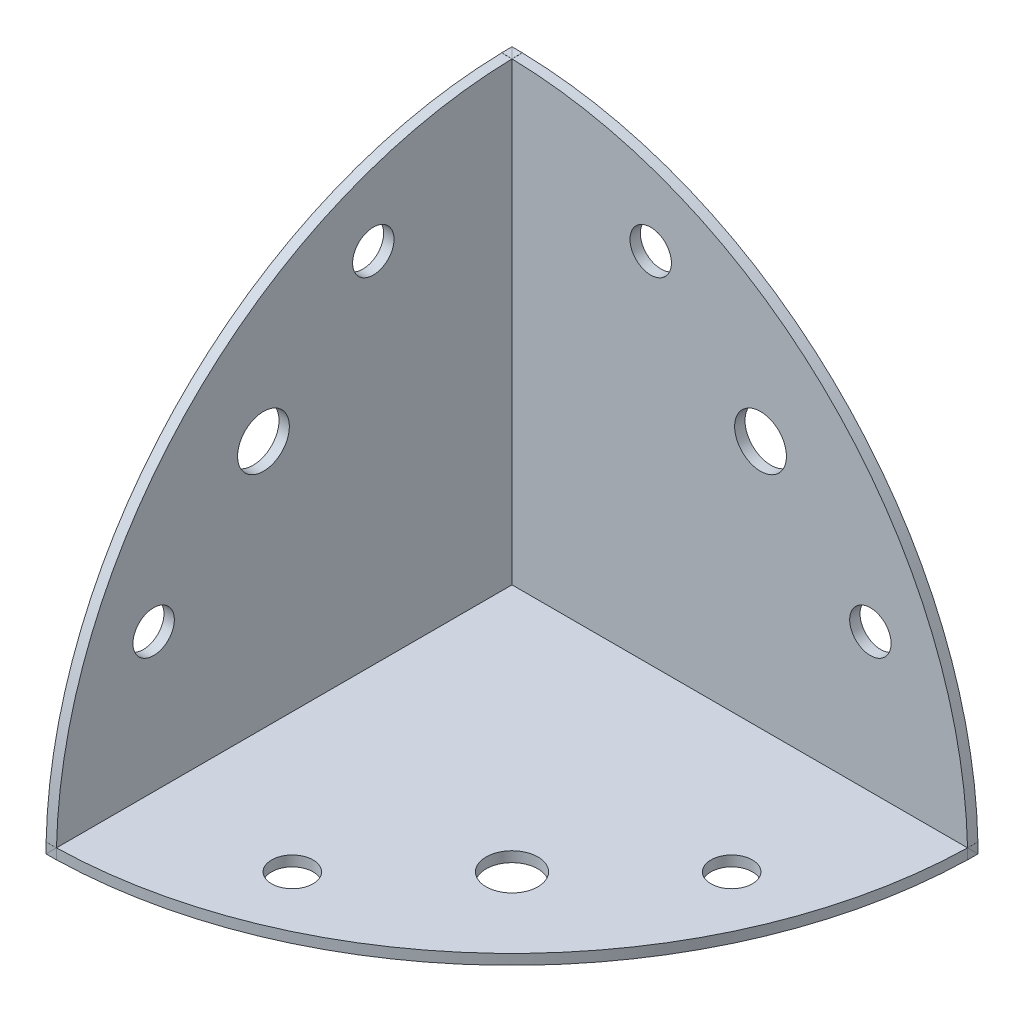
ISO-10303-21;
HEADER;
FILE_DESCRIPTION(('STEP AP214'),'2;1');
FILE_NAME('part.step','',(''),(''),'','','');
FILE_SCHEMA(('AUTOMOTIVE_DESIGN { 1 0 10303 214 1 1 1 1 }'));
ENDSEC;
DATA;
#1=APPLICATION_CONTEXT('core data for automotive mechanical design processes');
#2=APPLICATION_PROTOCOL_DEFINITION('international standard','automotive_design',2000,#1);
#3=PRODUCT_CONTEXT('',#1,'mechanical');
#4=PRODUCT('Part','Part','',(#3));
#5=PRODUCT_RELATED_PRODUCT_CATEGORY('part','',(#4));
#6=PRODUCT_DEFINITION_FORMATION('','',#4);
#7=PRODUCT_DEFINITION_CONTEXT('part definition',#1,'design');
#8=PRODUCT_DEFINITION('design','',#6,#7);
#9=PRODUCT_DEFINITION_SHAPE('','',#8);
#10=(LENGTH_UNIT() NAMED_UNIT(*) SI_UNIT(.MILLI.,.METRE.));
#11=(NAMED_UNIT(*) PLANE_ANGLE_UNIT() SI_UNIT($,.RADIAN.));
#12=(NAMED_UNIT(*) SI_UNIT($,.STERADIAN.) SOLID_ANGLE_UNIT());
#13=UNCERTAINTY_MEASURE_WITH_UNIT(LENGTH_MEASURE(1.E-05),#10,'distance_accuracy_value','');
#14=(GEOMETRIC_REPRESENTATION_CONTEXT(3) GLOBAL_UNCERTAINTY_ASSIGNED_CONTEXT((#13)) GLOBAL_UNIT_ASSIGNED_CONTEXT((#10,
#11,#12)) REPRESENTATION_CONTEXT('',''));
#15=CARTESIAN_POINT('',(0.,0.,0.));
#16=DIRECTION('',(0.,0.,1.));
#17=DIRECTION('',(1.,0.,0.));
#18=AXIS2_PLACEMENT_3D('',#15,#16,#17);
#19=CARTESIAN_POINT('',(0.,1.,0.));
#20=DIRECTION('',(0.,-1.,0.));
#21=DIRECTION('',(0.,0.,-1.));
#22=AXIS2_PLACEMENT_3D('',#19,#20,#21);
#23=PLANE('',#22);
#24=DIRECTION('',(-1.,0.,0.));
#25=VECTOR('',#24,1.);
#26=CARTESIAN_POINT('',(1.,1.,44.988887516808));
#27=LINE('',#26,#25);
#28=CARTESIAN_POINT('',(9.50100314789726E-13,1.,44.988887516808));
#29=VERTEX_POINT('',#28);
#30=CARTESIAN_POINT('',(1.,1.,44.988887516808));
#31=VERTEX_POINT('',#30);
#32=EDGE_CURVE('E205',#29,#31,#27,.F.);
#33=ORIENTED_EDGE('',*,*,#32,.F.);
#34=DIRECTION('',(0.,0.,1.));
#35=VECTOR('',#34,1.);
#36=CARTESIAN_POINT('',(9.5033499438199E-13,1.,45.));
#37=LINE('',#36,#35);
#38=CARTESIAN_POINT('',(9.5033499438199E-13,1.,45.));
#39=VERTEX_POINT('',#38);
#40=EDGE_CURVE('E267',#29,#39,#37,.T.);
#41=ORIENTED_EDGE('',*,*,#40,.T.);
#42=CARTESIAN_POINT('',(0.,1.,0.));
#43=DIRECTION('',(0.,1.,0.));
#44=DIRECTION('',(0.,0.,-1.));
#45=AXIS2_PLACEMENT_3D('',#42,#43,#44);
#46=CIRCLE('',#45,45.);
#47=EDGE_CURVE('E270',#39,#31,#46,.T.);
#48=ORIENTED_EDGE('',*,*,#47,.T.);
#49=EDGE_LOOP('',(#33,#41,#48));
#50=FACE_BOUND('',#49,.T.);
#51=ADVANCED_FACE('F33',(#50),#23,.F.);
#52=CARTESIAN_POINT('',(0.,1.,0.));
#53=DIRECTION('',(0.,-1.,0.));
#54=DIRECTION('',(0.,0.,-1.));
#55=AXIS2_PLACEMENT_3D('',#52,#53,#54);
#56=CYLINDRICAL_SURFACE('',#55,45.);
#57=CARTESIAN_POINT('',(0.,0.,0.));
#58=DIRECTION('',(0.707106781186547,-0.707106781186547,0.));
#59=DIRECTION('',(-0.707106781186547,-0.707106781186547,0.));
#60=AXIS2_PLACEMENT_3D('',#57,#58,#59);
#61=ELLIPSE('',#60,63.6396103067893,45.);
#62=CARTESIAN_POINT('',(0.,0.,45.));
#63=VERTEX_POINT('',#62);
#64=EDGE_CURVE('E55',#31,#63,#61,.T.);
#65=ORIENTED_EDGE('',*,*,#64,.F.);
#66=ORIENTED_EDGE('',*,*,#47,.F.);
#67=DIRECTION('',(0.,-1.,0.));
#68=VECTOR('',#67,1.);
#69=CARTESIAN_POINT('',(9.5033499438199E-13,1.,45.));
#70=LINE('',#69,#68);
#71=EDGE_CURVE('E281',#39,#63,#70,.T.);
#72=ORIENTED_EDGE('',*,*,#71,.T.);
#73=EDGE_LOOP('',(#65,#66,#72));
#74=FACE_BOUND('',#73,.T.);
#75=ADVANCED_FACE('F328',(#74),#56,.T.);
#76=CARTESIAN_POINT('',(0.,0.,1.));
#77=DIRECTION('',(0.,0.,-1.));
#78=DIRECTION('',(-1.,0.,0.));
#79=AXIS2_PLACEMENT_3D('',#76,#77,#78);
#80=PLANE('',#79);
#81=DIRECTION('',(-1.,0.,0.));
#82=VECTOR('',#81,1.);
#83=CARTESIAN_POINT('',(1.,44.988887516808,1.));
#84=LINE('',#83,#82);
#85=CARTESIAN_POINT('',(1.,44.988887516808,1.));
#86=VERTEX_POINT('',#85);
#87=CARTESIAN_POINT('',(0.,44.988887516808,1.));
#88=VERTEX_POINT('',#87);
#89=EDGE_CURVE('E132',#86,#88,#84,.T.);
#90=ORIENTED_EDGE('',*,*,#89,.F.);
#91=CARTESIAN_POINT('',(0.,0.,1.));
#92=DIRECTION('',(0.,0.,1.));
#93=DIRECTION('',(-1.,0.,0.));
#94=AXIS2_PLACEMENT_3D('',#91,#92,#93);
#95=CIRCLE('',#94,45.);
#96=CARTESIAN_POINT('',(0.,45.,1.));
#97=VERTEX_POINT('',#96);
#98=EDGE_CURVE('E229',#86,#97,#95,.T.);
#99=ORIENTED_EDGE('',*,*,#98,.T.);
#100=DIRECTION('',(0.,-1.,0.));
#101=VECTOR('',#100,1.);
#102=CARTESIAN_POINT('',(0.,45.,1.));
#103=LINE('',#102,#101);
#104=EDGE_CURVE('E233',#97,#88,#103,.T.);
#105=ORIENTED_EDGE('',*,*,#104,.T.);
#106=EDGE_LOOP('',(#90,#99,#105));
#107=FACE_BOUND('',#106,.T.);
#108=ADVANCED_FACE('F312',(#107),#80,.F.);
#109=CARTESIAN_POINT('',(0.,0.,1.));
#110=DIRECTION('',(0.,0.,-1.));
#111=DIRECTION('',(-1.,0.,0.));
#112=AXIS2_PLACEMENT_3D('',#109,#110,#111);
#113=CYLINDRICAL_SURFACE('',#112,45.);
#114=CARTESIAN_POINT('',(0.,0.,0.));
#115=DIRECTION('',(0.707106781186547,0.,-0.707106781186547));
#116=DIRECTION('',(-0.707106781186547,0.,-0.707106781186547));
#117=AXIS2_PLACEMENT_3D('',#114,#115,#116);
#118=ELLIPSE('',#117,63.6396103067893,45.);
#119=CARTESIAN_POINT('',(0.,45.,0.));
#120=VERTEX_POINT('',#119);
#121=EDGE_CURVE('E41',#120,#86,#118,.T.);
#122=ORIENTED_EDGE('',*,*,#121,.F.);
#123=DIRECTION('',(0.,0.,-1.));
#124=VECTOR('',#123,1.);
#125=CARTESIAN_POINT('',(0.,45.,1.));
#126=LINE('',#125,#124);
#127=EDGE_CURVE('E235',#97,#120,#126,.T.);
#128=ORIENTED_EDGE('',*,*,#127,.F.);
#129=ORIENTED_EDGE('',*,*,#98,.F.);
#130=EDGE_LOOP('',(#122,#128,#129));
#131=FACE_BOUND('',#130,.T.);
#132=ADVANCED_FACE('F316',(#131),#113,.T.);
#133=CARTESIAN_POINT('',(35.6066017177983,1.,14.3933982822021));
#134=DIRECTION('',(0.,1.,0.));
#135=DIRECTION('',(0.,0.,-1.));
#136=AXIS2_PLACEMENT_3D('',#133,#134,#135);
#137=CIRCLE('',#136,2.);
#138=CARTESIAN_POINT('',(35.6066017177983,1.,12.3933982822021));
#139=VERTEX_POINT('',#138);
#140=EDGE_CURVE('E247',#139,#139,#137,.T.);
#141=ORIENTED_EDGE('',*,*,#140,.F.);
#142=EDGE_LOOP('',(#141));
#143=FACE_BOUND('',#142,.T.);
#144=CARTESIAN_POINT('',(14.3933982822017,1.,35.6066017177984));
#145=DIRECTION('',(0.,1.,0.));
#146=DIRECTION('',(0.,0.,1.));
#147=AXIS2_PLACEMENT_3D('',#144,#145,#146);
#148=CIRCLE('',#147,2.);
#149=CARTESIAN_POINT('',(14.3933982822017,1.,37.6066017177984));
#150=VERTEX_POINT('',#149);
#151=EDGE_CURVE('E253',#150,#150,#148,.T.);
#152=ORIENTED_EDGE('',*,*,#151,.F.);
#153=EDGE_LOOP('',(#152));
#154=FACE_BOUND('',#153,.T.);
#155=CARTESIAN_POINT('',(25.,1.,25.0000000000003));
#156=DIRECTION('',(0.,1.,0.));
#157=DIRECTION('',(0.,0.,1.));
#158=AXIS2_PLACEMENT_3D('',#155,#156,#157);
#159=CIRCLE('',#158,2.5);
#160=CARTESIAN_POINT('',(25.,1.,27.5000000000003));
#161=VERTEX_POINT('',#160);
#162=EDGE_CURVE('E259',#161,#161,#159,.T.);
#163=ORIENTED_EDGE('',*,*,#162,.F.);
#164=EDGE_LOOP('',(#163));
#165=FACE_BOUND('',#164,.T.);
#166=DIRECTION('',(1.,0.,0.));
#167=VECTOR('',#166,1.);
#168=CARTESIAN_POINT('',(0.,1.,1.));
#169=LINE('',#168,#167);
#170=CARTESIAN_POINT('',(1.,1.,1.));
#171=VERTEX_POINT('',#170);
#172=CARTESIAN_POINT('',(44.988887516808,1.,1.));
#173=VERTEX_POINT('',#172);
#174=EDGE_CURVE('E244',#171,#173,#169,.T.);
#175=ORIENTED_EDGE('',*,*,#174,.F.);
#176=DIRECTION('',(0.,0.,1.));
#177=VECTOR('',#176,1.);
#178=CARTESIAN_POINT('',(1.,1.,0.));
#179=LINE('',#178,#177);
#180=EDGE_CURVE('E197',#171,#31,#179,.T.);
#181=ORIENTED_EDGE('',*,*,#180,.T.);
#182=EDGE_CURVE('E273',#31,#173,#46,.T.);
#183=ORIENTED_EDGE('',*,*,#182,.T.);
#184=EDGE_LOOP('',(#175,#181,#183));
#185=FACE_BOUND('',#184,.T.);
#186=ADVANCED_FACE('F339',(#143,#154,#165,#185),#23,.F.);
#187=DIRECTION('',(0.,0.,-1.));
#188=VECTOR('',#187,1.);
#189=CARTESIAN_POINT('',(44.988887516808,1.,1.));
#190=LINE('',#189,#188);
#191=CARTESIAN_POINT('',(44.988887516808,1.,0.));
#192=VERTEX_POINT('',#191);
#193=EDGE_CURVE('E241',#173,#192,#190,.T.);
#194=ORIENTED_EDGE('',*,*,#193,.F.);
#195=CARTESIAN_POINT('',(45.,1.,0.));
#196=VERTEX_POINT('',#195);
#197=EDGE_CURVE('E269',#173,#196,#46,.T.);
#198=ORIENTED_EDGE('',*,*,#197,.T.);
#199=DIRECTION('',(-1.,0.,0.));
#200=VECTOR('',#199,1.);
#201=CARTESIAN_POINT('',(0.,1.,0.));
#202=LINE('',#201,#200);
#203=EDGE_CURVE('E265',#196,#192,#202,.T.);
#204=ORIENTED_EDGE('',*,*,#203,.T.);
#205=EDGE_LOOP('',(#194,#198,#204));
#206=FACE_BOUND('',#205,.T.);
#207=ADVANCED_FACE('F305',(#206),#23,.F.);
#208=ORIENTED_EDGE('',*,*,#182,.F.);
#209=DIRECTION('',(0.,-1.,0.));
#210=VECTOR('',#209,1.);
#211=CARTESIAN_POINT('',(1.,1.,44.988887516808));
#212=LINE('',#211,#210);
#213=CARTESIAN_POINT('',(1.,0.,44.988887516808));
#214=VERTEX_POINT('',#213);
#215=EDGE_CURVE('E149',#31,#214,#212,.T.);
#216=ORIENTED_EDGE('',*,*,#215,.T.);
#217=CARTESIAN_POINT('',(0.,0.,0.));
#218=DIRECTION('',(0.,1.,0.));
#219=DIRECTION('',(0.,0.,-1.));
#220=AXIS2_PLACEMENT_3D('',#217,#218,#219);
#221=CIRCLE('',#220,45.);
#222=CARTESIAN_POINT('',(44.988887516808,0.,1.));
#223=VERTEX_POINT('',#222);
#224=EDGE_CURVE('E158',#214,#223,#221,.T.);
#225=ORIENTED_EDGE('',*,*,#224,.T.);
#226=DIRECTION('',(0.,-1.,0.));
#227=VECTOR('',#226,1.);
#228=CARTESIAN_POINT('',(44.988887516808,1.,1.));
#229=LINE('',#228,#227);
#230=EDGE_CURVE('E287',#173,#223,#229,.T.);
#231=ORIENTED_EDGE('',*,*,#230,.F.);
#232=EDGE_LOOP('',(#208,#216,#225,#231));
#233=FACE_BOUND('',#232,.T.);
#234=ADVANCED_FACE('F331',(#233),#56,.T.);
#235=CARTESIAN_POINT('',(0.,0.,0.));
#236=DIRECTION('',(0.,-0.707106781186547,0.707106781186547));
#237=DIRECTION('',(0.,-0.707106781186547,-0.707106781186547));
#238=AXIS2_PLACEMENT_3D('',#235,#236,#237);
#239=ELLIPSE('',#238,63.6396103067893,45.);
#240=CARTESIAN_POINT('',(45.,0.,0.));
#241=VERTEX_POINT('',#240);
#242=EDGE_CURVE('E284',#241,#173,#239,.T.);
#243=ORIENTED_EDGE('',*,*,#242,.F.);
#244=DIRECTION('',(0.,-1.,0.));
#245=VECTOR('',#244,1.);
#246=CARTESIAN_POINT('',(45.,1.,0.));
#247=LINE('',#246,#245);
#248=EDGE_CURVE('E272',#196,#241,#247,.T.);
#249=ORIENTED_EDGE('',*,*,#248,.F.);
#250=ORIENTED_EDGE('',*,*,#197,.F.);
#251=EDGE_LOOP('',(#243,#249,#250));
#252=FACE_BOUND('',#251,.T.);
#253=ADVANCED_FACE('F301',(#252),#56,.T.);
#254=CARTESIAN_POINT('',(0.,0.,0.));
#255=DIRECTION('',(0.,-1.,0.));
#256=DIRECTION('',(0.,0.,-1.));
#257=AXIS2_PLACEMENT_3D('',#254,#255,#256);
#258=PLANE('',#257);
#259=ORIENTED_EDGE('',*,*,#224,.F.);
#260=DIRECTION('',(0.,0.,-1.));
#261=VECTOR('',#260,1.);
#262=CARTESIAN_POINT('',(1.,0.,0.));
#263=LINE('',#262,#261);
#264=CARTESIAN_POINT('',(1.,0.,45.));
#265=VERTEX_POINT('',#264);
#266=EDGE_CURVE('E121',#265,#214,#263,.T.);
#267=ORIENTED_EDGE('',*,*,#266,.F.);
#268=DIRECTION('',(-1.,0.,0.));
#269=VECTOR('',#268,1.);
#270=CARTESIAN_POINT('',(1.,0.,45.));
#271=LINE('',#270,#269);
#272=EDGE_CURVE('E133',#265,#63,#271,.T.);
#273=ORIENTED_EDGE('',*,*,#272,.T.);
#274=DIRECTION('',(0.,0.,1.));
#275=VECTOR('',#274,1.);
#276=CARTESIAN_POINT('',(9.5033499438199E-13,0.,45.));
#277=LINE('',#276,#275);
#278=CARTESIAN_POINT('',(0.,0.,0.));
#279=VERTEX_POINT('',#278);
#280=EDGE_CURVE('E275',#279,#63,#277,.T.);
#281=ORIENTED_EDGE('',*,*,#280,.F.);
#282=DIRECTION('',(-1.,0.,0.));
#283=VECTOR('',#282,1.);
#284=CARTESIAN_POINT('',(0.,0.,0.));
#285=LINE('',#284,#283);
#286=EDGE_CURVE('E262',#241,#279,#285,.T.);
#287=ORIENTED_EDGE('',*,*,#286,.F.);
#288=DIRECTION('',(0.,0.,-1.));
#289=VECTOR('',#288,1.);
#290=CARTESIAN_POINT('',(45.,0.,1.));
#291=LINE('',#290,#289);
#292=CARTESIAN_POINT('',(45.,0.,1.));
#293=VERTEX_POINT('',#292);
#294=EDGE_CURVE('E238',#293,#241,#291,.T.);
#295=ORIENTED_EDGE('',*,*,#294,.F.);
#296=DIRECTION('',(1.,0.,0.));
#297=VECTOR('',#296,1.);
#298=CARTESIAN_POINT('',(0.,0.,1.));
#299=LINE('',#298,#297);
#300=EDGE_CURVE('E227',#223,#293,#299,.T.);
#301=ORIENTED_EDGE('',*,*,#300,.F.);
#302=EDGE_LOOP('',(#259,#267,#273,#281,#287,#295,#301));
#303=FACE_BOUND('',#302,.T.);
#304=CARTESIAN_POINT('',(14.3933982822017,0.,35.6066017177984));
#305=DIRECTION('',(0.,1.,0.));
#306=DIRECTION('',(0.,0.,1.));
#307=AXIS2_PLACEMENT_3D('',#304,#305,#306);
#308=CIRCLE('',#307,2.);
#309=CARTESIAN_POINT('',(14.3933982822017,0.,37.6066017177984));
#310=VERTEX_POINT('',#309);
#311=EDGE_CURVE('E250',#310,#310,#308,.T.);
#312=ORIENTED_EDGE('',*,*,#311,.T.);
#313=EDGE_LOOP('',(#312));
#314=FACE_BOUND('',#313,.T.);
#315=CARTESIAN_POINT('',(25.,0.,25.0000000000003));
#316=DIRECTION('',(0.,1.,0.));
#317=DIRECTION('',(0.,0.,1.));
#318=AXIS2_PLACEMENT_3D('',#315,#316,#317);
#319=CIRCLE('',#318,2.5);
#320=CARTESIAN_POINT('',(25.,0.,27.5000000000003));
#321=VERTEX_POINT('',#320);
#322=EDGE_CURVE('E256',#321,#321,#319,.T.);
#323=ORIENTED_EDGE('',*,*,#322,.T.);
#324=EDGE_LOOP('',(#323));
#325=FACE_BOUND('',#324,.T.);
#326=CARTESIAN_POINT('',(35.6066017177983,0.,14.3933982822021));
#327=DIRECTION('',(0.,1.,0.));
#328=DIRECTION('',(0.,0.,-1.));
#329=AXIS2_PLACEMENT_3D('',#326,#327,#328);
#330=CIRCLE('',#329,2.);
#331=CARTESIAN_POINT('',(35.6066017177983,0.,12.3933982822021));
#332=VERTEX_POINT('',#331);
#333=EDGE_CURVE('E246',#332,#332,#330,.T.);
#334=ORIENTED_EDGE('',*,*,#333,.T.);
#335=EDGE_LOOP('',(#334));
#336=FACE_BOUND('',#335,.T.);
#337=ADVANCED_FACE('F155',(#303,#314,#325,#336),#258,.T.);
#338=CARTESIAN_POINT('',(0.,1.,0.));
#339=DIRECTION('',(0.,0.,1.));
#340=DIRECTION('',(1.,0.,0.));
#341=AXIS2_PLACEMENT_3D('',#338,#339,#340);
#342=PLANE('',#341);
#343=ORIENTED_EDGE('',*,*,#286,.T.);
#344=DIRECTION('',(0.,-1.,0.));
#345=VECTOR('',#344,1.);
#346=CARTESIAN_POINT('',(0.,1.,0.));
#347=LINE('',#346,#345);
#348=EDGE_CURVE('E128',#120,#279,#347,.T.);
#349=ORIENTED_EDGE('',*,*,#348,.F.);
#350=DIRECTION('',(-1.,0.,0.));
#351=VECTOR('',#350,1.);
#352=CARTESIAN_POINT('',(1.,45.,0.));
#353=LINE('',#352,#351);
#354=CARTESIAN_POINT('',(1.,45.,0.));
#355=VERTEX_POINT('',#354);
#356=EDGE_CURVE('E125',#355,#120,#353,.T.);
#357=ORIENTED_EDGE('',*,*,#356,.F.);
#358=DIRECTION('',(0.,1.,0.));
#359=VECTOR('',#358,1.);
#360=CARTESIAN_POINT('',(1.,45.,0.));
#361=LINE('',#360,#359);
#362=CARTESIAN_POINT('',(1.,44.988887516808,0.));
#363=VERTEX_POINT('',#362);
#364=EDGE_CURVE('E112',#363,#355,#361,.T.);
#365=ORIENTED_EDGE('',*,*,#364,.F.);
#366=CARTESIAN_POINT('',(0.,0.,0.));
#367=DIRECTION('',(0.,0.,1.));
#368=DIRECTION('',(-1.,0.,0.));
#369=AXIS2_PLACEMENT_3D('',#366,#367,#368);
#370=CIRCLE('',#369,45.);
#371=EDGE_CURVE('E224',#192,#363,#370,.T.);
#372=ORIENTED_EDGE('',*,*,#371,.F.);
#373=ORIENTED_EDGE('',*,*,#203,.F.);
#374=ORIENTED_EDGE('',*,*,#248,.T.);
#375=EDGE_LOOP('',(#343,#349,#357,#365,#372,#373,#374));
#376=FACE_BOUND('',#375,.T.);
#377=CARTESIAN_POINT('',(35.6066017177983,14.3933982822021,0.));
#378=DIRECTION('',(0.,0.,1.));
#379=DIRECTION('',(-1.,0.,0.));
#380=AXIS2_PLACEMENT_3D('',#377,#378,#379);
#381=CIRCLE('',#380,2.);
#382=CARTESIAN_POINT('',(33.6066017177983,14.3933982822021,0.));
#383=VERTEX_POINT('',#382);
#384=EDGE_CURVE('E203',#383,#383,#381,.T.);
#385=ORIENTED_EDGE('',*,*,#384,.T.);
#386=EDGE_LOOP('',(#385));
#387=FACE_BOUND('',#386,.T.);
#388=CARTESIAN_POINT('',(25.,25.0000000000003,0.));
#389=DIRECTION('',(0.,0.,1.));
#390=DIRECTION('',(1.,0.,0.));
#391=AXIS2_PLACEMENT_3D('',#388,#389,#390);
#392=CIRCLE('',#391,2.5);
#393=CARTESIAN_POINT('',(27.5,25.0000000000003,0.));
#394=VERTEX_POINT('',#393);
#395=EDGE_CURVE('E218',#394,#394,#392,.T.);
#396=ORIENTED_EDGE('',*,*,#395,.T.);
#397=EDGE_LOOP('',(#396));
#398=FACE_BOUND('',#397,.T.);
#399=CARTESIAN_POINT('',(14.3933982822017,35.6066017177984,0.));
#400=DIRECTION('',(0.,0.,1.));
#401=DIRECTION('',(1.,0.,0.));
#402=AXIS2_PLACEMENT_3D('',#399,#400,#401);
#403=CIRCLE('',#402,2.);
#404=CARTESIAN_POINT('',(16.3933982822017,35.6066017177984,0.));
#405=VERTEX_POINT('',#404);
#406=EDGE_CURVE('E212',#405,#405,#403,.T.);
#407=ORIENTED_EDGE('',*,*,#406,.T.);
#408=EDGE_LOOP('',(#407));
#409=FACE_BOUND('',#408,.T.);
#410=ADVANCED_FACE('F35',(#376,#387,#398,#409),#342,.F.);
#411=CARTESIAN_POINT('',(9.5033499438199E-13,1.,45.));
#412=DIRECTION('',(1.,0.,0.));
#413=DIRECTION('',(0.,0.,-1.));
#414=AXIS2_PLACEMENT_3D('',#411,#412,#413);
#415=PLANE('',#414);
#416=ORIENTED_EDGE('',*,*,#40,.F.);
#417=CARTESIAN_POINT('',(0.,0.,0.));
#418=DIRECTION('',(1.,0.,0.));
#419=DIRECTION('',(0.,0.,-1.));
#420=AXIS2_PLACEMENT_3D('',#417,#418,#419);
#421=CIRCLE('',#420,45.);
#422=EDGE_CURVE('E159',#88,#29,#421,.T.);
#423=ORIENTED_EDGE('',*,*,#422,.F.);
#424=ORIENTED_EDGE('',*,*,#104,.F.);
#425=ORIENTED_EDGE('',*,*,#127,.T.);
#426=ORIENTED_EDGE('',*,*,#348,.T.);
#427=ORIENTED_EDGE('',*,*,#280,.T.);
#428=ORIENTED_EDGE('',*,*,#71,.F.);
#429=EDGE_LOOP('',(#416,#423,#424,#425,#426,#427,#428));
#430=FACE_BOUND('',#429,.T.);
#431=CARTESIAN_POINT('',(0.,24.9999999999997,25.));
#432=DIRECTION('',(1.,0.,0.));
#433=DIRECTION('',(0.,0.,-1.));
#434=AXIS2_PLACEMENT_3D('',#431,#432,#433);
#435=CIRCLE('',#434,2.5);
#436=CARTESIAN_POINT('',(0.,24.9999999999997,22.5));
#437=VERTEX_POINT('',#436);
#438=EDGE_CURVE('E164',#437,#437,#435,.T.);
#439=ORIENTED_EDGE('',*,*,#438,.T.);
#440=EDGE_LOOP('',(#439));
#441=FACE_BOUND('',#440,.T.);
#442=CARTESIAN_POINT('',(0.,35.606601717798,14.3933982822018));
#443=DIRECTION('',(1.,0.,0.));
#444=DIRECTION('',(0.,0.,-1.));
#445=AXIS2_PLACEMENT_3D('',#442,#443,#444);
#446=CIRCLE('',#445,2.);
#447=CARTESIAN_POINT('',(0.,35.606601717798,12.3933982822018));
#448=VERTEX_POINT('',#447);
#449=EDGE_CURVE('E170',#448,#448,#446,.T.);
#450=ORIENTED_EDGE('',*,*,#449,.T.);
#451=EDGE_LOOP('',(#450));
#452=FACE_BOUND('',#451,.T.);
#453=CARTESIAN_POINT('',(0.,14.3933982822015,35.6066017177981));
#454=DIRECTION('',(1.,0.,0.));
#455=DIRECTION('',(0.,0.,1.));
#456=AXIS2_PLACEMENT_3D('',#453,#454,#455);
#457=CIRCLE('',#456,2.);
#458=CARTESIAN_POINT('',(0.,14.3933982822015,37.6066017177981));
#459=VERTEX_POINT('',#458);
#460=EDGE_CURVE('E176',#459,#459,#457,.T.);
#461=ORIENTED_EDGE('',*,*,#460,.T.);
#462=EDGE_LOOP('',(#461));
#463=FACE_BOUND('',#462,.T.);
#464=ADVANCED_FACE('F320',(#430,#441,#452,#463),#415,.F.);
#465=CARTESIAN_POINT('',(25.,1.,25.0000000000003));
#466=DIRECTION('',(0.,-1.,0.));
#467=DIRECTION('',(0.,0.,-1.));
#468=AXIS2_PLACEMENT_3D('',#465,#466,#467);
#469=CYLINDRICAL_SURFACE('',#468,2.5);
#470=ORIENTED_EDGE('',*,*,#162,.T.);
#471=EDGE_LOOP('',(#470));
#472=FACE_BOUND('',#471,.T.);
#473=ORIENTED_EDGE('',*,*,#322,.F.);
#474=EDGE_LOOP('',(#473));
#475=FACE_BOUND('',#474,.T.);
#476=ADVANCED_FACE('F366',(#472,#475),#469,.F.);
#477=CARTESIAN_POINT('',(14.3933982822017,1.,35.6066017177984));
#478=DIRECTION('',(0.,-1.,0.));
#479=DIRECTION('',(0.,0.,-1.));
#480=AXIS2_PLACEMENT_3D('',#477,#478,#479);
#481=CYLINDRICAL_SURFACE('',#480,2.);
#482=ORIENTED_EDGE('',*,*,#151,.T.);
#483=EDGE_LOOP('',(#482));
#484=FACE_BOUND('',#483,.T.);
#485=ORIENTED_EDGE('',*,*,#311,.F.);
#486=EDGE_LOOP('',(#485));
#487=FACE_BOUND('',#486,.T.);
#488=ADVANCED_FACE('F362',(#484,#487),#481,.F.);
#489=CARTESIAN_POINT('',(35.6066017177983,1.,14.3933982822021));
#490=DIRECTION('',(0.,-1.,0.));
#491=DIRECTION('',(0.,0.,-1.));
#492=AXIS2_PLACEMENT_3D('',#489,#490,#491);
#493=CYLINDRICAL_SURFACE('',#492,2.);
#494=ORIENTED_EDGE('',*,*,#140,.T.);
#495=EDGE_LOOP('',(#494));
#496=FACE_BOUND('',#495,.T.);
#497=ORIENTED_EDGE('',*,*,#333,.F.);
#498=EDGE_LOOP('',(#497));
#499=FACE_BOUND('',#498,.T.);
#500=ADVANCED_FACE('F359',(#496,#499),#493,.F.);
#501=ORIENTED_EDGE('',*,*,#294,.T.);
#502=ORIENTED_EDGE('',*,*,#242,.T.);
#503=EDGE_CURVE('E230',#293,#173,#95,.T.);
#504=ORIENTED_EDGE('',*,*,#503,.F.);
#505=EDGE_LOOP('',(#501,#502,#504));
#506=FACE_BOUND('',#505,.T.);
#507=ADVANCED_FACE('F298',(#506),#113,.T.);
#508=ORIENTED_EDGE('',*,*,#503,.T.);
#509=ORIENTED_EDGE('',*,*,#230,.T.);
#510=ORIENTED_EDGE('',*,*,#300,.T.);
#511=EDGE_LOOP('',(#508,#509,#510));
#512=FACE_BOUND('',#511,.T.);
#513=ADVANCED_FACE('F291',(#512),#80,.F.);
#514=CARTESIAN_POINT('',(25.,25.0000000000003,1.));
#515=DIRECTION('',(0.,0.,1.));
#516=DIRECTION('',(1.,0.,0.));
#517=AXIS2_PLACEMENT_3D('',#514,#515,#516);
#518=CIRCLE('',#517,2.5);
#519=CARTESIAN_POINT('',(27.5,25.0000000000003,1.));
#520=VERTEX_POINT('',#519);
#521=EDGE_CURVE('E221',#520,#520,#518,.T.);
#522=ORIENTED_EDGE('',*,*,#521,.F.);
#523=EDGE_LOOP('',(#522));
#524=FACE_BOUND('',#523,.T.);
#525=CARTESIAN_POINT('',(14.3933982822017,35.6066017177984,1.));
#526=DIRECTION('',(0.,0.,1.));
#527=DIRECTION('',(1.,0.,0.));
#528=AXIS2_PLACEMENT_3D('',#525,#526,#527);
#529=CIRCLE('',#528,2.);
#530=CARTESIAN_POINT('',(16.3933982822017,35.6066017177984,1.));
#531=VERTEX_POINT('',#530);
#532=EDGE_CURVE('E215',#531,#531,#529,.T.);
#533=ORIENTED_EDGE('',*,*,#532,.F.);
#534=EDGE_LOOP('',(#533));
#535=FACE_BOUND('',#534,.T.);
#536=CARTESIAN_POINT('',(35.6066017177983,14.3933982822021,1.));
#537=DIRECTION('',(0.,0.,1.));
#538=DIRECTION('',(-1.,0.,0.));
#539=AXIS2_PLACEMENT_3D('',#536,#537,#538);
#540=CIRCLE('',#539,2.);
#541=CARTESIAN_POINT('',(33.6066017177983,14.3933982822021,1.));
#542=VERTEX_POINT('',#541);
#543=EDGE_CURVE('E209',#542,#542,#540,.T.);
#544=ORIENTED_EDGE('',*,*,#543,.F.);
#545=EDGE_LOOP('',(#544));
#546=FACE_BOUND('',#545,.T.);
#547=EDGE_CURVE('E48',#173,#86,#95,.T.);
#548=ORIENTED_EDGE('',*,*,#547,.T.);
#549=DIRECTION('',(0.,-1.,0.));
#550=VECTOR('',#549,1.);
#551=CARTESIAN_POINT('',(1.,0.,1.));
#552=LINE('',#551,#550);
#553=EDGE_CURVE('E198',#86,#171,#552,.T.);
#554=ORIENTED_EDGE('',*,*,#553,.T.);
#555=ORIENTED_EDGE('',*,*,#174,.T.);
#556=EDGE_LOOP('',(#548,#554,#555));
#557=FACE_BOUND('',#556,.T.);
#558=ADVANCED_FACE('F337',(#524,#535,#546,#557),#80,.F.);
#559=ORIENTED_EDGE('',*,*,#371,.T.);
#560=DIRECTION('',(0.,0.,-1.));
#561=VECTOR('',#560,1.);
#562=CARTESIAN_POINT('',(1.,44.988887516808,1.));
#563=LINE('',#562,#561);
#564=EDGE_CURVE('E11',#363,#86,#563,.F.);
#565=ORIENTED_EDGE('',*,*,#564,.T.);
#566=ORIENTED_EDGE('',*,*,#547,.F.);
#567=ORIENTED_EDGE('',*,*,#193,.T.);
#568=EDGE_LOOP('',(#559,#565,#566,#567));
#569=FACE_BOUND('',#568,.T.);
#570=ADVANCED_FACE('F307',(#569),#113,.T.);
#571=CARTESIAN_POINT('',(25.,25.0000000000003,1.));
#572=DIRECTION('',(0.,0.,-1.));
#573=DIRECTION('',(-1.,0.,0.));
#574=AXIS2_PLACEMENT_3D('',#571,#572,#573);
#575=CYLINDRICAL_SURFACE('',#574,2.5);
#576=ORIENTED_EDGE('',*,*,#521,.T.);
#577=EDGE_LOOP('',(#576));
#578=FACE_BOUND('',#577,.T.);
#579=ORIENTED_EDGE('',*,*,#395,.F.);
#580=EDGE_LOOP('',(#579));
#581=FACE_BOUND('',#580,.T.);
#582=ADVANCED_FACE('F352',(#578,#581),#575,.F.);
#583=CARTESIAN_POINT('',(14.3933982822017,35.6066017177984,1.));
#584=DIRECTION('',(0.,0.,-1.));
#585=DIRECTION('',(-1.,0.,0.));
#586=AXIS2_PLACEMENT_3D('',#583,#584,#585);
#587=CYLINDRICAL_SURFACE('',#586,2.);
#588=ORIENTED_EDGE('',*,*,#532,.T.);
#589=EDGE_LOOP('',(#588));
#590=FACE_BOUND('',#589,.T.);
#591=ORIENTED_EDGE('',*,*,#406,.F.);
#592=EDGE_LOOP('',(#591));
#593=FACE_BOUND('',#592,.T.);
#594=ADVANCED_FACE('F414',(#590,#593),#587,.F.);
#595=CARTESIAN_POINT('',(35.6066017177983,14.3933982822021,1.));
#596=DIRECTION('',(0.,0.,-1.));
#597=DIRECTION('',(-1.,0.,0.));
#598=AXIS2_PLACEMENT_3D('',#595,#596,#597);
#599=CYLINDRICAL_SURFACE('',#598,2.);
#600=ORIENTED_EDGE('',*,*,#543,.T.);
#601=EDGE_LOOP('',(#600));
#602=FACE_BOUND('',#601,.T.);
#603=ORIENTED_EDGE('',*,*,#384,.F.);
#604=EDGE_LOOP('',(#603));
#605=FACE_BOUND('',#604,.T.);
#606=ADVANCED_FACE('F424',(#602,#605),#599,.F.);
#607=CARTESIAN_POINT('',(1.,0.,0.));
#608=DIRECTION('',(-1.,0.,0.));
#609=DIRECTION('',(0.,0.,1.));
#610=AXIS2_PLACEMENT_3D('',#607,#608,#609);
#611=CYLINDRICAL_SURFACE('',#610,45.);
#612=ORIENTED_EDGE('',*,*,#356,.T.);
#613=ORIENTED_EDGE('',*,*,#121,.T.);
#614=CARTESIAN_POINT('',(1.,0.,0.));
#615=DIRECTION('',(1.,0.,0.));
#616=DIRECTION('',(0.,0.,-1.));
#617=AXIS2_PLACEMENT_3D('',#614,#615,#616);
#618=CIRCLE('',#617,45.);
#619=EDGE_CURVE('E116',#355,#86,#618,.T.);
#620=ORIENTED_EDGE('',*,*,#619,.F.);
#621=EDGE_LOOP('',(#612,#613,#620));
#622=FACE_BOUND('',#621,.T.);
#623=ADVANCED_FACE('F135',(#622),#611,.T.);
#624=CARTESIAN_POINT('',(1.,0.,0.));
#625=DIRECTION('',(1.,0.,0.));
#626=DIRECTION('',(0.,0.,-1.));
#627=AXIS2_PLACEMENT_3D('',#624,#625,#626);
#628=PLANE('',#627);
#629=ORIENTED_EDGE('',*,*,#564,.F.);
#630=ORIENTED_EDGE('',*,*,#364,.T.);
#631=ORIENTED_EDGE('',*,*,#619,.T.);
#632=EDGE_LOOP('',(#629,#630,#631));
#633=FACE_BOUND('',#632,.T.);
#634=ADVANCED_FACE('F114',(#633),#628,.T.);
#635=CARTESIAN_POINT('',(1.,14.3933982822015,35.6066017177981));
#636=DIRECTION('',(-1.,0.,0.));
#637=DIRECTION('',(0.,0.,1.));
#638=AXIS2_PLACEMENT_3D('',#635,#636,#637);
#639=CYLINDRICAL_SURFACE('',#638,2.);
#640=CARTESIAN_POINT('',(1.,14.3933982822015,35.6066017177981));
#641=DIRECTION('',(1.,0.,0.));
#642=DIRECTION('',(0.,0.,1.));
#643=AXIS2_PLACEMENT_3D('',#640,#641,#642);
#644=CIRCLE('',#643,2.);
#645=CARTESIAN_POINT('',(1.,14.3933982822015,37.6066017177981));
#646=VERTEX_POINT('',#645);
#647=EDGE_CURVE('E173',#646,#646,#644,.T.);
#648=ORIENTED_EDGE('',*,*,#647,.T.);
#649=EDGE_LOOP('',(#648));
#650=FACE_BOUND('',#649,.T.);
#651=ORIENTED_EDGE('',*,*,#460,.F.);
#652=EDGE_LOOP('',(#651));
#653=FACE_BOUND('',#652,.T.);
#654=ADVANCED_FACE('F182',(#650,#653),#639,.F.);
#655=CARTESIAN_POINT('',(1.,35.606601717798,14.3933982822018));
#656=DIRECTION('',(-1.,0.,0.));
#657=DIRECTION('',(0.,0.,1.));
#658=AXIS2_PLACEMENT_3D('',#655,#656,#657);
#659=CYLINDRICAL_SURFACE('',#658,2.);
#660=CARTESIAN_POINT('',(1.,35.606601717798,14.3933982822018));
#661=DIRECTION('',(1.,0.,0.));
#662=DIRECTION('',(0.,0.,-1.));
#663=AXIS2_PLACEMENT_3D('',#660,#661,#662);
#664=CIRCLE('',#663,2.);
#665=CARTESIAN_POINT('',(1.,35.606601717798,12.3933982822018));
#666=VERTEX_POINT('',#665);
#667=EDGE_CURVE('E167',#666,#666,#664,.T.);
#668=ORIENTED_EDGE('',*,*,#667,.T.);
#669=EDGE_LOOP('',(#668));
#670=FACE_BOUND('',#669,.T.);
#671=ORIENTED_EDGE('',*,*,#449,.F.);
#672=EDGE_LOOP('',(#671));
#673=FACE_BOUND('',#672,.T.);
#674=ADVANCED_FACE('F511',(#670,#673),#659,.F.);
#675=CARTESIAN_POINT('',(1.,24.9999999999997,25.));
#676=DIRECTION('',(-1.,0.,0.));
#677=DIRECTION('',(0.,0.,1.));
#678=AXIS2_PLACEMENT_3D('',#675,#676,#677);
#679=CYLINDRICAL_SURFACE('',#678,2.5);
#680=CARTESIAN_POINT('',(1.,24.9999999999997,25.));
#681=DIRECTION('',(1.,0.,0.));
#682=DIRECTION('',(0.,0.,-1.));
#683=AXIS2_PLACEMENT_3D('',#680,#681,#682);
#684=CIRCLE('',#683,2.5);
#685=CARTESIAN_POINT('',(1.,24.9999999999997,22.5));
#686=VERTEX_POINT('',#685);
#687=EDGE_CURVE('E162',#686,#686,#684,.T.);
#688=ORIENTED_EDGE('',*,*,#687,.T.);
#689=EDGE_LOOP('',(#688));
#690=FACE_BOUND('',#689,.T.);
#691=ORIENTED_EDGE('',*,*,#438,.F.);
#692=EDGE_LOOP('',(#691));
#693=FACE_BOUND('',#692,.T.);
#694=ADVANCED_FACE('F519',(#690,#693),#679,.F.);
#695=ORIENTED_EDGE('',*,*,#422,.T.);
#696=ORIENTED_EDGE('',*,*,#32,.T.);
#697=EDGE_CURVE('E136',#86,#31,#618,.T.);
#698=ORIENTED_EDGE('',*,*,#697,.F.);
#699=ORIENTED_EDGE('',*,*,#89,.T.);
#700=EDGE_LOOP('',(#695,#696,#698,#699));
#701=FACE_BOUND('',#700,.T.);
#702=ADVANCED_FACE('F188',(#701),#611,.T.);
#703=ORIENTED_EDGE('',*,*,#647,.F.);
#704=EDGE_LOOP('',(#703));
#705=FACE_BOUND('',#704,.T.);
#706=ORIENTED_EDGE('',*,*,#687,.F.);
#707=EDGE_LOOP('',(#706));
#708=FACE_BOUND('',#707,.T.);
#709=ORIENTED_EDGE('',*,*,#667,.F.);
#710=EDGE_LOOP('',(#709));
#711=FACE_BOUND('',#710,.T.);
#712=ORIENTED_EDGE('',*,*,#180,.F.);
#713=ORIENTED_EDGE('',*,*,#553,.F.);
#714=ORIENTED_EDGE('',*,*,#697,.T.);
#715=EDGE_LOOP('',(#712,#713,#714));
#716=FACE_BOUND('',#715,.T.);
#717=ADVANCED_FACE('F185',(#705,#708,#711,#716),#628,.T.);
#718=ORIENTED_EDGE('',*,*,#215,.F.);
#719=EDGE_CURVE('E120',#31,#265,#618,.T.);
#720=ORIENTED_EDGE('',*,*,#719,.T.);
#721=ORIENTED_EDGE('',*,*,#266,.T.);
#722=EDGE_LOOP('',(#718,#720,#721));
#723=FACE_BOUND('',#722,.T.);
#724=ADVANCED_FACE('F147',(#723),#628,.T.);
#725=ORIENTED_EDGE('',*,*,#719,.F.);
#726=ORIENTED_EDGE('',*,*,#64,.T.);
#727=ORIENTED_EDGE('',*,*,#272,.F.);
#728=EDGE_LOOP('',(#725,#726,#727));
#729=FACE_BOUND('',#728,.T.);
#730=ADVANCED_FACE('F151',(#729),#611,.T.);
#731=CLOSED_SHELL('',(#51,#75,#108,#132,#186,#207,#234,#253,#337,#410,#464,#476,#488,#500,#507,
#513,#558,#570,#582,#594,#606,#623,#634,#654,#674,#694,#702,#717,#724,#730));
#732=MANIFOLD_SOLID_BREP('B2',#731);
#733=ADVANCED_BREP_SHAPE_REPRESENTATION('',(#18,#732),#14);
#734=SHAPE_DEFINITION_REPRESENTATION(#9,#733);
ENDSEC;
END-ISO-10303-21;
